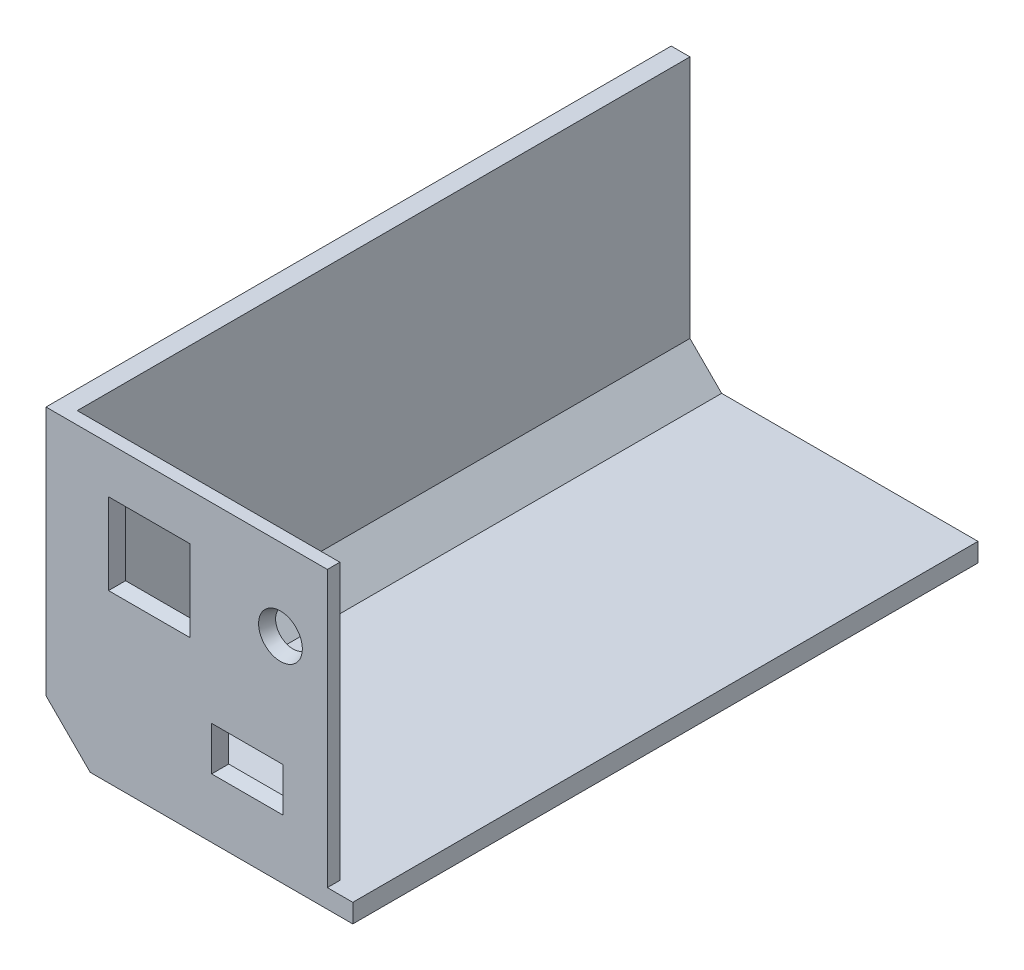
ISO-10303-21;
HEADER;
FILE_DESCRIPTION(('STEP AP214'),'2;1');
FILE_NAME('part.step','',(''),(''),'','','');
FILE_SCHEMA(('AUTOMOTIVE_DESIGN { 1 0 10303 214 1 1 1 1 }'));
ENDSEC;
DATA;
#1=APPLICATION_CONTEXT('core data for automotive mechanical design processes');
#2=APPLICATION_PROTOCOL_DEFINITION('international standard','automotive_design',2000,#1);
#3=PRODUCT_CONTEXT('',#1,'mechanical');
#4=PRODUCT('Part','Part','',(#3));
#5=PRODUCT_RELATED_PRODUCT_CATEGORY('part','',(#4));
#6=PRODUCT_DEFINITION_FORMATION('','',#4);
#7=PRODUCT_DEFINITION_CONTEXT('part definition',#1,'design');
#8=PRODUCT_DEFINITION('design','',#6,#7);
#9=PRODUCT_DEFINITION_SHAPE('','',#8);
#10=(LENGTH_UNIT() NAMED_UNIT(*) SI_UNIT(.MILLI.,.METRE.));
#11=(NAMED_UNIT(*) PLANE_ANGLE_UNIT() SI_UNIT($,.RADIAN.));
#12=(NAMED_UNIT(*) SI_UNIT($,.STERADIAN.) SOLID_ANGLE_UNIT());
#13=UNCERTAINTY_MEASURE_WITH_UNIT(LENGTH_MEASURE(1.E-05),#10,'distance_accuracy_value','');
#14=(GEOMETRIC_REPRESENTATION_CONTEXT(3) GLOBAL_UNCERTAINTY_ASSIGNED_CONTEXT((#13)) GLOBAL_UNIT_ASSIGNED_CONTEXT((#10,
#11,#12)) REPRESENTATION_CONTEXT('',''));
#15=CARTESIAN_POINT('',(0.,0.,0.));
#16=DIRECTION('',(0.,0.,1.));
#17=DIRECTION('',(1.,0.,0.));
#18=AXIS2_PLACEMENT_3D('',#15,#16,#17);
#19=CARTESIAN_POINT('',(0.,0.,100.));
#20=DIRECTION('',(0.,1.,0.));
#21=DIRECTION('',(0.,0.,1.));
#22=AXIS2_PLACEMENT_3D('',#19,#20,#21);
#23=PLANE('',#22);
#24=DIRECTION('',(1.,0.,0.));
#25=VECTOR('',#24,1.);
#26=CARTESIAN_POINT('',(0.,0.,0.));
#27=LINE('',#26,#25);
#28=CARTESIAN_POINT('',(0.,0.,0.));
#29=VERTEX_POINT('',#28);
#30=CARTESIAN_POINT('',(42.,0.,0.));
#31=VERTEX_POINT('',#30);
#32=EDGE_CURVE('E260',#29,#31,#27,.T.);
#33=ORIENTED_EDGE('',*,*,#32,.T.);
#34=DIRECTION('',(0.,0.,-1.));
#35=VECTOR('',#34,1.);
#36=CARTESIAN_POINT('',(42.,0.,100.));
#37=LINE('',#36,#35);
#38=CARTESIAN_POINT('',(42.,0.,100.));
#39=VERTEX_POINT('',#38);
#40=EDGE_CURVE('E11',#39,#31,#37,.T.);
#41=ORIENTED_EDGE('',*,*,#40,.F.);
#42=DIRECTION('',(1.,0.,0.));
#43=VECTOR('',#42,1.);
#44=CARTESIAN_POINT('',(0.,0.,100.));
#45=LINE('',#44,#43);
#46=CARTESIAN_POINT('',(0.,0.,100.));
#47=VERTEX_POINT('',#46);
#48=EDGE_CURVE('E263',#47,#39,#45,.T.);
#49=ORIENTED_EDGE('',*,*,#48,.F.);
#50=DIRECTION('',(0.,0.,-1.));
#51=VECTOR('',#50,1.);
#52=CARTESIAN_POINT('',(0.,0.,100.));
#53=LINE('',#52,#51);
#54=EDGE_CURVE('E278',#47,#29,#53,.T.);
#55=ORIENTED_EDGE('',*,*,#54,.T.);
#56=EDGE_LOOP('',(#33,#41,#49,#55));
#57=FACE_BOUND('',#56,.T.);
#58=ADVANCED_FACE('F43',(#57),#23,.F.);
#59=CARTESIAN_POINT('',(42.,3.,100.));
#60=DIRECTION('',(-1.,0.,0.));
#61=DIRECTION('',(0.,0.,1.));
#62=AXIS2_PLACEMENT_3D('',#59,#60,#61);
#63=PLANE('',#62);
#64=DIRECTION('',(0.,1.,0.));
#65=VECTOR('',#64,1.);
#66=CARTESIAN_POINT('',(42.,3.,0.));
#67=LINE('',#66,#65);
#68=CARTESIAN_POINT('',(42.,3.,0.));
#69=VERTEX_POINT('',#68);
#70=EDGE_CURVE('E281',#31,#69,#67,.T.);
#71=ORIENTED_EDGE('',*,*,#70,.T.);
#72=DIRECTION('',(0.,0.,-1.));
#73=VECTOR('',#72,1.);
#74=CARTESIAN_POINT('',(42.,3.,100.));
#75=LINE('',#74,#73);
#76=CARTESIAN_POINT('',(42.,3.,100.));
#77=VERTEX_POINT('',#76);
#78=EDGE_CURVE('E50',#77,#69,#75,.T.);
#79=ORIENTED_EDGE('',*,*,#78,.F.);
#80=DIRECTION('',(0.,1.,0.));
#81=VECTOR('',#80,1.);
#82=CARTESIAN_POINT('',(42.,3.,100.));
#83=LINE('',#82,#81);
#84=EDGE_CURVE('E266',#39,#77,#83,.T.);
#85=ORIENTED_EDGE('',*,*,#84,.F.);
#86=ORIENTED_EDGE('',*,*,#40,.T.);
#87=EDGE_LOOP('',(#71,#79,#85,#86));
#88=FACE_BOUND('',#87,.T.);
#89=ADVANCED_FACE('F337',(#88),#63,.F.);
#90=CARTESIAN_POINT('',(1.,3.,100.));
#91=DIRECTION('',(0.,-1.,0.));
#92=DIRECTION('',(0.,0.,-1.));
#93=AXIS2_PLACEMENT_3D('',#90,#91,#92);
#94=PLANE('',#93);
#95=DIRECTION('',(1.,0.,0.));
#96=VECTOR('',#95,1.);
#97=CARTESIAN_POINT('',(1.,3.,98.));
#98=LINE('',#97,#96);
#99=CARTESIAN_POINT('',(1.,3.,98.));
#100=VERTEX_POINT('',#99);
#101=CARTESIAN_POINT('',(37.9289321881345,3.,98.));
#102=VERTEX_POINT('',#101);
#103=EDGE_CURVE('E239',#100,#102,#98,.T.);
#104=ORIENTED_EDGE('',*,*,#103,.T.);
#105=DIRECTION('',(0.,0.,1.));
#106=VECTOR('',#105,1.);
#107=CARTESIAN_POINT('',(37.9289321881345,3.,98.));
#108=LINE('',#107,#106);
#109=CARTESIAN_POINT('',(37.9289321881345,3.,100.));
#110=VERTEX_POINT('',#109);
#111=EDGE_CURVE('E254',#102,#110,#108,.T.);
#112=ORIENTED_EDGE('',*,*,#111,.T.);
#113=DIRECTION('',(-1.,0.,0.));
#114=VECTOR('',#113,1.);
#115=CARTESIAN_POINT('',(1.,3.,100.));
#116=LINE('',#115,#114);
#117=EDGE_CURVE('E269',#77,#110,#116,.T.);
#118=ORIENTED_EDGE('',*,*,#117,.F.);
#119=ORIENTED_EDGE('',*,*,#78,.T.);
#120=DIRECTION('',(-1.,0.,0.));
#121=VECTOR('',#120,1.);
#122=CARTESIAN_POINT('',(1.,3.,0.));
#123=LINE('',#122,#121);
#124=CARTESIAN_POINT('',(1.,3.,0.));
#125=VERTEX_POINT('',#124);
#126=EDGE_CURVE('E283',#69,#125,#123,.T.);
#127=ORIENTED_EDGE('',*,*,#126,.T.);
#128=DIRECTION('',(0.,0.,-1.));
#129=VECTOR('',#128,1.);
#130=CARTESIAN_POINT('',(1.,3.,100.));
#131=LINE('',#130,#129);
#132=EDGE_CURVE('E309',#100,#125,#131,.T.);
#133=ORIENTED_EDGE('',*,*,#132,.F.);
#134=EDGE_LOOP('',(#104,#112,#118,#119,#127,#133));
#135=FACE_BOUND('',#134,.T.);
#136=ADVANCED_FACE('F315',(#135),#94,.F.);
#137=CARTESIAN_POINT('',(-4.07106781186546,8.07106781186548,100.));
#138=DIRECTION('',(-0.707106781186549,-0.707106781186546,0.));
#139=DIRECTION('',(0.707106781186546,-0.707106781186549,0.));
#140=AXIS2_PLACEMENT_3D('',#137,#138,#139);
#141=PLANE('',#140);
#142=DIRECTION('',(0.,0.,-1.));
#143=VECTOR('',#142,1.);
#144=CARTESIAN_POINT('',(-4.07106781186546,8.07106781186548,100.));
#145=LINE('',#144,#143);
#146=CARTESIAN_POINT('',(-4.07106781186546,8.07106781186548,98.));
#147=VERTEX_POINT('',#146);
#148=CARTESIAN_POINT('',(-4.07106781186546,8.07106781186548,0.));
#149=VERTEX_POINT('',#148);
#150=EDGE_CURVE('E307',#147,#149,#145,.T.);
#151=ORIENTED_EDGE('',*,*,#150,.F.);
#152=DIRECTION('',(0.707106781186546,-0.707106781186549,0.));
#153=VECTOR('',#152,1.);
#154=CARTESIAN_POINT('',(-4.07106781186546,8.07106781186548,98.));
#155=LINE('',#154,#153);
#156=EDGE_CURVE('E251',#147,#100,#155,.T.);
#157=ORIENTED_EDGE('',*,*,#156,.T.);
#158=ORIENTED_EDGE('',*,*,#132,.T.);
#159=DIRECTION('',(-0.707106781186546,0.707106781186549,0.));
#160=VECTOR('',#159,1.);
#161=CARTESIAN_POINT('',(-4.07106781186546,8.07106781186548,0.));
#162=LINE('',#161,#160);
#163=EDGE_CURVE('E286',#125,#149,#162,.T.);
#164=ORIENTED_EDGE('',*,*,#163,.T.);
#165=EDGE_LOOP('',(#151,#157,#158,#164));
#166=FACE_BOUND('',#165,.T.);
#167=ADVANCED_FACE('F326',(#166),#141,.F.);
#168=CARTESIAN_POINT('',(-4.07106781186547,47.0737593986685,100.));
#169=DIRECTION('',(-1.,0.,0.));
#170=DIRECTION('',(0.,-1.,0.));
#171=AXIS2_PLACEMENT_3D('',#168,#169,#170);
#172=PLANE('',#171);
#173=DIRECTION('',(0.,0.,-1.));
#174=VECTOR('',#173,1.);
#175=CARTESIAN_POINT('',(-4.07106781186547,47.0737593986685,100.));
#176=LINE('',#175,#174);
#177=CARTESIAN_POINT('',(-4.07106781186547,47.0737593986685,98.));
#178=VERTEX_POINT('',#177);
#179=CARTESIAN_POINT('',(-4.07106781186547,47.0737593986685,0.));
#180=VERTEX_POINT('',#179);
#181=EDGE_CURVE('E305',#178,#180,#176,.T.);
#182=ORIENTED_EDGE('',*,*,#181,.F.);
#183=DIRECTION('',(0.,-1.,0.));
#184=VECTOR('',#183,1.);
#185=CARTESIAN_POINT('',(-4.07106781186547,47.0737593986685,98.));
#186=LINE('',#185,#184);
#187=EDGE_CURVE('E248',#178,#147,#186,.T.);
#188=ORIENTED_EDGE('',*,*,#187,.T.);
#189=ORIENTED_EDGE('',*,*,#150,.T.);
#190=DIRECTION('',(0.,1.,0.));
#191=VECTOR('',#190,1.);
#192=CARTESIAN_POINT('',(-4.07106781186547,47.0737593986685,0.));
#193=LINE('',#192,#191);
#194=EDGE_CURVE('E289',#149,#180,#193,.T.);
#195=ORIENTED_EDGE('',*,*,#194,.T.);
#196=EDGE_LOOP('',(#182,#188,#189,#195));
#197=FACE_BOUND('',#196,.T.);
#198=ADVANCED_FACE('F353',(#197),#172,.F.);
#199=CARTESIAN_POINT('',(-7.07106781186547,47.0737593986685,100.));
#200=DIRECTION('',(0.,-1.,0.));
#201=DIRECTION('',(0.,0.,-1.));
#202=AXIS2_PLACEMENT_3D('',#199,#200,#201);
#203=PLANE('',#202);
#204=DIRECTION('',(-1.,0.,0.));
#205=VECTOR('',#204,1.);
#206=CARTESIAN_POINT('',(-7.07106781186547,47.0737593986685,0.));
#207=LINE('',#206,#205);
#208=CARTESIAN_POINT('',(-7.07106781186547,47.0737593986685,0.));
#209=VERTEX_POINT('',#208);
#210=EDGE_CURVE('E292',#180,#209,#207,.T.);
#211=ORIENTED_EDGE('',*,*,#210,.T.);
#212=DIRECTION('',(0.,0.,-1.));
#213=VECTOR('',#212,1.);
#214=CARTESIAN_POINT('',(-7.07106781186547,47.0737593986685,100.));
#215=LINE('',#214,#213);
#216=CARTESIAN_POINT('',(-7.07106781186547,47.0737593986685,100.));
#217=VERTEX_POINT('',#216);
#218=EDGE_CURVE('E302',#217,#209,#215,.T.);
#219=ORIENTED_EDGE('',*,*,#218,.F.);
#220=DIRECTION('',(-1.,0.,0.));
#221=VECTOR('',#220,1.);
#222=CARTESIAN_POINT('',(-7.07106781186547,47.0737593986685,100.));
#223=LINE('',#222,#221);
#224=CARTESIAN_POINT('',(37.9289321881345,47.0737593986685,100.));
#225=VERTEX_POINT('',#224);
#226=EDGE_CURVE('E272',#225,#217,#223,.T.);
#227=ORIENTED_EDGE('',*,*,#226,.F.);
#228=DIRECTION('',(0.,0.,1.));
#229=VECTOR('',#228,1.);
#230=CARTESIAN_POINT('',(37.9289321881345,47.0737593986685,98.));
#231=LINE('',#230,#229);
#232=CARTESIAN_POINT('',(37.9289321881345,47.0737593986685,98.));
#233=VERTEX_POINT('',#232);
#234=EDGE_CURVE('E257',#233,#225,#231,.T.);
#235=ORIENTED_EDGE('',*,*,#234,.F.);
#236=DIRECTION('',(-1.,0.,0.));
#237=VECTOR('',#236,1.);
#238=CARTESIAN_POINT('',(-4.07106781186547,47.0737593986685,98.));
#239=LINE('',#238,#237);
#240=EDGE_CURVE('E245',#233,#178,#239,.T.);
#241=ORIENTED_EDGE('',*,*,#240,.T.);
#242=ORIENTED_EDGE('',*,*,#181,.T.);
#243=EDGE_LOOP('',(#211,#219,#227,#235,#241,#242));
#244=FACE_BOUND('',#243,.T.);
#245=ADVANCED_FACE('F350',(#244),#203,.F.);
#246=CARTESIAN_POINT('',(-7.07106781186547,47.0737593986685,100.));
#247=DIRECTION('',(1.,0.,0.));
#248=DIRECTION('',(0.,1.,0.));
#249=AXIS2_PLACEMENT_3D('',#246,#247,#248);
#250=PLANE('',#249);
#251=DIRECTION('',(0.,-1.,0.));
#252=VECTOR('',#251,1.);
#253=CARTESIAN_POINT('',(-7.07106781186547,47.0737593986685,0.));
#254=LINE('',#253,#252);
#255=CARTESIAN_POINT('',(-7.07106781186546,7.07106781186549,0.));
#256=VERTEX_POINT('',#255);
#257=EDGE_CURVE('E294',#209,#256,#254,.T.);
#258=ORIENTED_EDGE('',*,*,#257,.T.);
#259=DIRECTION('',(0.,0.,-1.));
#260=VECTOR('',#259,1.);
#261=CARTESIAN_POINT('',(-7.07106781186546,7.07106781186549,100.));
#262=LINE('',#261,#260);
#263=CARTESIAN_POINT('',(-7.07106781186546,7.07106781186549,100.));
#264=VERTEX_POINT('',#263);
#265=EDGE_CURVE('E299',#264,#256,#262,.T.);
#266=ORIENTED_EDGE('',*,*,#265,.F.);
#267=DIRECTION('',(0.,-1.,0.));
#268=VECTOR('',#267,1.);
#269=CARTESIAN_POINT('',(-7.07106781186547,47.0737593986685,100.));
#270=LINE('',#269,#268);
#271=EDGE_CURVE('E274',#217,#264,#270,.T.);
#272=ORIENTED_EDGE('',*,*,#271,.F.);
#273=ORIENTED_EDGE('',*,*,#218,.T.);
#274=EDGE_LOOP('',(#258,#266,#272,#273));
#275=FACE_BOUND('',#274,.T.);
#276=ADVANCED_FACE('F348',(#275),#250,.F.);
#277=CARTESIAN_POINT('',(-7.07106781186546,7.07106781186549,100.));
#278=DIRECTION('',(0.707106781186549,0.707106781186546,0.));
#279=DIRECTION('',(-0.707106781186546,0.707106781186549,0.));
#280=AXIS2_PLACEMENT_3D('',#277,#278,#279);
#281=PLANE('',#280);
#282=DIRECTION('',(0.707106781186546,-0.707106781186549,0.));
#283=VECTOR('',#282,1.);
#284=CARTESIAN_POINT('',(-7.07106781186546,7.07106781186549,0.));
#285=LINE('',#284,#283);
#286=EDGE_CURVE('E267',#256,#29,#285,.T.);
#287=ORIENTED_EDGE('',*,*,#286,.T.);
#288=ORIENTED_EDGE('',*,*,#54,.F.);
#289=DIRECTION('',(0.707106781186546,-0.707106781186549,0.));
#290=VECTOR('',#289,1.);
#291=CARTESIAN_POINT('',(-7.07106781186546,7.07106781186549,100.));
#292=LINE('',#291,#290);
#293=EDGE_CURVE('E276',#264,#47,#292,.T.);
#294=ORIENTED_EDGE('',*,*,#293,.F.);
#295=ORIENTED_EDGE('',*,*,#265,.T.);
#296=EDGE_LOOP('',(#287,#288,#294,#295));
#297=FACE_BOUND('',#296,.T.);
#298=ADVANCED_FACE('F343',(#297),#281,.F.);
#299=CARTESIAN_POINT('',(0.,0.,100.));
#300=DIRECTION('',(0.,0.,-1.));
#301=DIRECTION('',(-1.,0.,0.));
#302=AXIS2_PLACEMENT_3D('',#299,#300,#301);
#303=PLANE('',#302);
#304=DIRECTION('',(-1.,0.,0.));
#305=VECTOR('',#304,1.);
#306=CARTESIAN_POINT('',(2.92893218813453,39.6440022228814,100.));
#307=LINE('',#306,#305);
#308=CARTESIAN_POINT('',(15.9289321881345,39.6440022228814,100.));
#309=VERTEX_POINT('',#308);
#310=CARTESIAN_POINT('',(2.92893218813453,39.6440022228814,100.));
#311=VERTEX_POINT('',#310);
#312=EDGE_CURVE('E220',#309,#311,#307,.T.);
#313=ORIENTED_EDGE('',*,*,#312,.F.);
#314=DIRECTION('',(0.,1.,0.));
#315=VECTOR('',#314,1.);
#316=CARTESIAN_POINT('',(15.9289321881345,39.6440022228814,100.));
#317=LINE('',#316,#315);
#318=CARTESIAN_POINT('',(15.9289321881345,26.6440022228814,100.));
#319=VERTEX_POINT('',#318);
#320=EDGE_CURVE('E57',#319,#309,#317,.T.);
#321=ORIENTED_EDGE('',*,*,#320,.F.);
#322=DIRECTION('',(1.,0.,0.));
#323=VECTOR('',#322,1.);
#324=CARTESIAN_POINT('',(2.92893218813453,26.6440022228814,100.));
#325=LINE('',#324,#323);
#326=CARTESIAN_POINT('',(2.92893218813453,26.6440022228814,100.));
#327=VERTEX_POINT('',#326);
#328=EDGE_CURVE('E213',#327,#319,#325,.T.);
#329=ORIENTED_EDGE('',*,*,#328,.F.);
#330=DIRECTION('',(0.,-1.,0.));
#331=VECTOR('',#330,1.);
#332=CARTESIAN_POINT('',(2.92893218813453,39.6440022228814,100.));
#333=LINE('',#332,#331);
#334=EDGE_CURVE('E217',#311,#327,#333,.T.);
#335=ORIENTED_EDGE('',*,*,#334,.F.);
#336=EDGE_LOOP('',(#313,#321,#329,#335));
#337=FACE_BOUND('',#336,.T.);
#338=DIRECTION('',(-1.,0.,0.));
#339=VECTOR('',#338,1.);
#340=CARTESIAN_POINT('',(19.4289321881345,16.5,100.));
#341=LINE('',#340,#339);
#342=CARTESIAN_POINT('',(30.8759582309003,16.5,100.));
#343=VERTEX_POINT('',#342);
#344=CARTESIAN_POINT('',(19.4289321881345,16.5,100.));
#345=VERTEX_POINT('',#344);
#346=EDGE_CURVE('E191',#343,#345,#341,.T.);
#347=ORIENTED_EDGE('',*,*,#346,.F.);
#348=DIRECTION('',(0.,1.,0.));
#349=VECTOR('',#348,1.);
#350=CARTESIAN_POINT('',(30.8759582309003,16.5,100.));
#351=LINE('',#350,#349);
#352=CARTESIAN_POINT('',(30.8759582309003,9.5,100.));
#353=VERTEX_POINT('',#352);
#354=EDGE_CURVE('E65',#353,#343,#351,.T.);
#355=ORIENTED_EDGE('',*,*,#354,.F.);
#356=DIRECTION('',(1.,0.,0.));
#357=VECTOR('',#356,1.);
#358=CARTESIAN_POINT('',(19.4289321881345,9.5,100.));
#359=LINE('',#358,#357);
#360=CARTESIAN_POINT('',(19.4289321881345,9.5,100.));
#361=VERTEX_POINT('',#360);
#362=EDGE_CURVE('E178',#361,#353,#359,.T.);
#363=ORIENTED_EDGE('',*,*,#362,.F.);
#364=DIRECTION('',(0.,-1.,0.));
#365=VECTOR('',#364,1.);
#366=CARTESIAN_POINT('',(19.4289321881345,16.5,100.));
#367=LINE('',#366,#365);
#368=EDGE_CURVE('E184',#345,#361,#367,.T.);
#369=ORIENTED_EDGE('',*,*,#368,.F.);
#370=EDGE_LOOP('',(#347,#355,#363,#369));
#371=FACE_BOUND('',#370,.T.);
#372=CARTESIAN_POINT('',(30.4289321881345,34.0737593986685,100.));
#373=DIRECTION('',(0.,0.,1.));
#374=DIRECTION('',(1.,0.,0.));
#375=AXIS2_PLACEMENT_3D('',#372,#373,#374);
#376=CIRCLE('',#375,3.5);
#377=CARTESIAN_POINT('',(33.9289321881345,34.0737593986685,100.));
#378=VERTEX_POINT('',#377);
#379=EDGE_CURVE('E233',#378,#378,#376,.T.);
#380=ORIENTED_EDGE('',*,*,#379,.F.);
#381=EDGE_LOOP('',(#380));
#382=FACE_BOUND('',#381,.T.);
#383=ORIENTED_EDGE('',*,*,#117,.T.);
#384=DIRECTION('',(0.,1.,0.));
#385=VECTOR('',#384,1.);
#386=CARTESIAN_POINT('',(37.9289321881345,47.0737593986685,100.));
#387=LINE('',#386,#385);
#388=EDGE_CURVE('E236',#110,#225,#387,.T.);
#389=ORIENTED_EDGE('',*,*,#388,.T.);
#390=ORIENTED_EDGE('',*,*,#226,.T.);
#391=ORIENTED_EDGE('',*,*,#271,.T.);
#392=ORIENTED_EDGE('',*,*,#293,.T.);
#393=ORIENTED_EDGE('',*,*,#48,.T.);
#394=ORIENTED_EDGE('',*,*,#84,.T.);
#395=EDGE_LOOP('',(#383,#389,#390,#391,#392,#393,#394));
#396=FACE_BOUND('',#395,.T.);
#397=ADVANCED_FACE('F188',(#337,#371,#382,#396),#303,.F.);
#398=CARTESIAN_POINT('',(0.,0.,0.));
#399=DIRECTION('',(0.,0.,-1.));
#400=DIRECTION('',(-1.,0.,0.));
#401=AXIS2_PLACEMENT_3D('',#398,#399,#400);
#402=PLANE('',#401);
#403=ORIENTED_EDGE('',*,*,#32,.F.);
#404=ORIENTED_EDGE('',*,*,#286,.F.);
#405=ORIENTED_EDGE('',*,*,#257,.F.);
#406=ORIENTED_EDGE('',*,*,#210,.F.);
#407=ORIENTED_EDGE('',*,*,#194,.F.);
#408=ORIENTED_EDGE('',*,*,#163,.F.);
#409=ORIENTED_EDGE('',*,*,#126,.F.);
#410=ORIENTED_EDGE('',*,*,#70,.F.);
#411=EDGE_LOOP('',(#403,#404,#405,#406,#407,#408,#409,#410));
#412=FACE_BOUND('',#411,.T.);
#413=ADVANCED_FACE('F321',(#412),#402,.T.);
#414=CARTESIAN_POINT('',(37.9289321881345,47.0737593986685,98.));
#415=DIRECTION('',(1.,0.,0.));
#416=DIRECTION('',(0.,1.,0.));
#417=AXIS2_PLACEMENT_3D('',#414,#415,#416);
#418=PLANE('',#417);
#419=ORIENTED_EDGE('',*,*,#388,.F.);
#420=ORIENTED_EDGE('',*,*,#111,.F.);
#421=DIRECTION('',(0.,1.,0.));
#422=VECTOR('',#421,1.);
#423=CARTESIAN_POINT('',(37.9289321881345,47.0737593986685,98.));
#424=LINE('',#423,#422);
#425=EDGE_CURVE('E242',#102,#233,#424,.T.);
#426=ORIENTED_EDGE('',*,*,#425,.T.);
#427=ORIENTED_EDGE('',*,*,#234,.T.);
#428=EDGE_LOOP('',(#419,#420,#426,#427));
#429=FACE_BOUND('',#428,.T.);
#430=ADVANCED_FACE('F332',(#429),#418,.T.);
#431=CARTESIAN_POINT('',(0.,0.,98.));
#432=DIRECTION('',(0.,0.,-1.));
#433=DIRECTION('',(-1.,0.,0.));
#434=AXIS2_PLACEMENT_3D('',#431,#432,#433);
#435=PLANE('',#434);
#436=DIRECTION('',(0.,1.,0.));
#437=VECTOR('',#436,1.);
#438=CARTESIAN_POINT('',(15.2009917196021,39.6440022228814,98.));
#439=LINE('',#438,#437);
#440=CARTESIAN_POINT('',(15.2009917196021,27.3719426914138,98.));
#441=VERTEX_POINT('',#440);
#442=CARTESIAN_POINT('',(15.2009917196021,38.916061754349,98.));
#443=VERTEX_POINT('',#442);
#444=EDGE_CURVE('E224',#441,#443,#439,.T.);
#445=ORIENTED_EDGE('',*,*,#444,.T.);
#446=DIRECTION('',(-1.,0.,0.));
#447=VECTOR('',#446,1.);
#448=CARTESIAN_POINT('',(2.92893218813453,38.916061754349,98.));
#449=LINE('',#448,#447);
#450=CARTESIAN_POINT('',(3.65687265666693,38.916061754349,98.));
#451=VERTEX_POINT('',#450);
#452=EDGE_CURVE('E203',#443,#451,#449,.T.);
#453=ORIENTED_EDGE('',*,*,#452,.T.);
#454=DIRECTION('',(0.,-1.,0.));
#455=VECTOR('',#454,1.);
#456=CARTESIAN_POINT('',(3.65687265666693,39.6440022228814,98.));
#457=LINE('',#456,#455);
#458=CARTESIAN_POINT('',(3.65687265666694,27.3719426914138,98.));
#459=VERTEX_POINT('',#458);
#460=EDGE_CURVE('E230',#451,#459,#457,.T.);
#461=ORIENTED_EDGE('',*,*,#460,.T.);
#462=DIRECTION('',(1.,0.,0.));
#463=VECTOR('',#462,1.);
#464=CARTESIAN_POINT('',(2.92893218813453,27.3719426914138,98.));
#465=LINE('',#464,#463);
#466=EDGE_CURVE('E227',#459,#441,#465,.T.);
#467=ORIENTED_EDGE('',*,*,#466,.T.);
#468=EDGE_LOOP('',(#445,#453,#461,#467));
#469=FACE_BOUND('',#468,.T.);
#470=DIRECTION('',(0.,1.,0.));
#471=VECTOR('',#470,1.);
#472=CARTESIAN_POINT('',(30.1480177623679,16.5,98.));
#473=LINE('',#472,#471);
#474=CARTESIAN_POINT('',(30.1480177623679,10.2279404685324,98.));
#475=VERTEX_POINT('',#474);
#476=CARTESIAN_POINT('',(30.1480177623679,15.7720595314676,98.));
#477=VERTEX_POINT('',#476);
#478=EDGE_CURVE('E171',#475,#477,#473,.T.);
#479=ORIENTED_EDGE('',*,*,#478,.T.);
#480=DIRECTION('',(-1.,0.,0.));
#481=VECTOR('',#480,1.);
#482=CARTESIAN_POINT('',(19.4289321881345,15.7720595314676,98.));
#483=LINE('',#482,#481);
#484=CARTESIAN_POINT('',(20.1568726566669,15.7720595314676,98.));
#485=VERTEX_POINT('',#484);
#486=EDGE_CURVE('E175',#477,#485,#483,.T.);
#487=ORIENTED_EDGE('',*,*,#486,.T.);
#488=DIRECTION('',(0.,-1.,0.));
#489=VECTOR('',#488,1.);
#490=CARTESIAN_POINT('',(20.1568726566669,16.5,98.));
#491=LINE('',#490,#489);
#492=CARTESIAN_POINT('',(20.1568726566669,10.2279404685324,98.));
#493=VERTEX_POINT('',#492);
#494=EDGE_CURVE('E199',#485,#493,#491,.T.);
#495=ORIENTED_EDGE('',*,*,#494,.T.);
#496=DIRECTION('',(1.,0.,0.));
#497=VECTOR('',#496,1.);
#498=CARTESIAN_POINT('',(19.4289321881345,10.2279404685324,98.));
#499=LINE('',#498,#497);
#500=EDGE_CURVE('E193',#493,#475,#499,.T.);
#501=ORIENTED_EDGE('',*,*,#500,.T.);
#502=EDGE_LOOP('',(#479,#487,#495,#501));
#503=FACE_BOUND('',#502,.T.);
#504=CARTESIAN_POINT('',(30.4289321881345,34.0737593986685,98.));
#505=DIRECTION('',(0.,0.,-1.));
#506=DIRECTION('',(-1.,0.,0.));
#507=AXIS2_PLACEMENT_3D('',#504,#505,#506);
#508=CIRCLE('',#507,2.77205953146759);
#509=CARTESIAN_POINT('',(27.6568726566669,34.0737593986685,98.));
#510=VERTEX_POINT('',#509);
#511=EDGE_CURVE('E202',#510,#510,#508,.F.);
#512=ORIENTED_EDGE('',*,*,#511,.T.);
#513=EDGE_LOOP('',(#512));
#514=FACE_BOUND('',#513,.T.);
#515=ORIENTED_EDGE('',*,*,#103,.F.);
#516=ORIENTED_EDGE('',*,*,#156,.F.);
#517=ORIENTED_EDGE('',*,*,#187,.F.);
#518=ORIENTED_EDGE('',*,*,#240,.F.);
#519=ORIENTED_EDGE('',*,*,#425,.F.);
#520=EDGE_LOOP('',(#515,#516,#517,#518,#519));
#521=FACE_BOUND('',#520,.T.);
#522=ADVANCED_FACE('F329',(#469,#503,#514,#521),#435,.T.);
#523=CARTESIAN_POINT('',(30.4289321881345,34.0737593986685,100.));
#524=DIRECTION('',(0.,0.,1.));
#525=DIRECTION('',(1.,0.,0.));
#526=AXIS2_PLACEMENT_3D('',#523,#524,#525);
#527=CONICAL_SURFACE('',#526,3.5,0.349065850398866);
#528=ORIENTED_EDGE('',*,*,#511,.F.);
#529=EDGE_LOOP('',(#528));
#530=FACE_BOUND('',#529,.T.);
#531=ORIENTED_EDGE('',*,*,#379,.T.);
#532=EDGE_LOOP('',(#531));
#533=FACE_BOUND('',#532,.T.);
#534=ADVANCED_FACE('F437',(#530,#533),#527,.F.);
#535=CARTESIAN_POINT('',(30.8759582309003,16.5,100.));
#536=DIRECTION('',(0.939692620785908,0.,-0.342020143325669));
#537=DIRECTION('',(-0.342020143325669,0.,-0.939692620785908));
#538=AXIS2_PLACEMENT_3D('',#535,#536,#537);
#539=PLANE('',#538);
#540=DIRECTION('',(0.323615577118185,-0.323615577118185,0.889126490715988));
#541=VECTOR('',#540,1.);
#542=CARTESIAN_POINT('',(29.6771450565657,10.6988131743345,96.7062878733711));
#543=LINE('',#542,#541);
#544=EDGE_CURVE('E167',#475,#353,#543,.T.);
#545=ORIENTED_EDGE('',*,*,#544,.T.);
#546=ORIENTED_EDGE('',*,*,#354,.T.);
#547=DIRECTION('',(0.323615577118185,0.323615577118185,0.889126490715988));
#548=VECTOR('',#547,1.);
#549=CARTESIAN_POINT('',(30.8759582309003,16.5,100.));
#550=LINE('',#549,#548);
#551=EDGE_CURVE('E185',#477,#343,#550,.T.);
#552=ORIENTED_EDGE('',*,*,#551,.F.);
#553=ORIENTED_EDGE('',*,*,#478,.F.);
#554=EDGE_LOOP('',(#545,#546,#552,#553));
#555=FACE_BOUND('',#554,.T.);
#556=ADVANCED_FACE('F169',(#555),#539,.F.);
#557=CARTESIAN_POINT('',(19.4289321881345,9.5,100.));
#558=DIRECTION('',(0.,-0.939692620785908,-0.342020143325669));
#559=DIRECTION('',(0.,0.342020143325669,-0.939692620785909));
#560=AXIS2_PLACEMENT_3D('',#557,#558,#559);
#561=PLANE('',#560);
#562=DIRECTION('',(-0.323615577118185,-0.323615577118185,0.889126490715988));
#563=VECTOR('',#562,1.);
#564=CARTESIAN_POINT('',(20.1620214804093,10.2330892922747,97.9858537230312));
#565=LINE('',#564,#563);
#566=EDGE_CURVE('E174',#493,#361,#565,.T.);
#567=ORIENTED_EDGE('',*,*,#566,.T.);
#568=ORIENTED_EDGE('',*,*,#362,.T.);
#569=ORIENTED_EDGE('',*,*,#544,.F.);
#570=ORIENTED_EDGE('',*,*,#500,.F.);
#571=EDGE_LOOP('',(#567,#568,#569,#570));
#572=FACE_BOUND('',#571,.T.);
#573=ADVANCED_FACE('F179',(#572),#561,.F.);
#574=CARTESIAN_POINT('',(19.4289321881345,16.5,100.));
#575=DIRECTION('',(-0.939692620785908,0.,-0.342020143325669));
#576=DIRECTION('',(-0.342020143325669,0.,0.939692620785908));
#577=AXIS2_PLACEMENT_3D('',#574,#575,#576);
#578=PLANE('',#577);
#579=DIRECTION('',(-0.323615577118185,0.323615577118185,0.889126490715988));
#580=VECTOR('',#579,1.);
#581=CARTESIAN_POINT('',(19.4289321881345,16.5,100.));
#582=LINE('',#581,#580);
#583=EDGE_CURVE('E638',#485,#345,#582,.T.);
#584=ORIENTED_EDGE('',*,*,#583,.T.);
#585=ORIENTED_EDGE('',*,*,#368,.T.);
#586=ORIENTED_EDGE('',*,*,#566,.F.);
#587=ORIENTED_EDGE('',*,*,#494,.F.);
#588=EDGE_LOOP('',(#584,#585,#586,#587));
#589=FACE_BOUND('',#588,.T.);
#590=ADVANCED_FACE('F464',(#589),#578,.F.);
#591=CARTESIAN_POINT('',(19.4289321881345,16.5,100.));
#592=DIRECTION('',(0.,0.939692620785908,-0.342020143325669));
#593=DIRECTION('',(0.,0.342020143325669,0.939692620785909));
#594=AXIS2_PLACEMENT_3D('',#591,#592,#593);
#595=PLANE('',#594);
#596=ORIENTED_EDGE('',*,*,#551,.T.);
#597=ORIENTED_EDGE('',*,*,#346,.T.);
#598=ORIENTED_EDGE('',*,*,#583,.F.);
#599=ORIENTED_EDGE('',*,*,#486,.F.);
#600=EDGE_LOOP('',(#596,#597,#598,#599));
#601=FACE_BOUND('',#600,.T.);
#602=ADVANCED_FACE('F473',(#601),#595,.F.);
#603=CARTESIAN_POINT('',(15.9289321881345,39.6440022228814,100.));
#604=DIRECTION('',(0.939692620785908,0.,-0.342020143325669));
#605=DIRECTION('',(-0.342020143325669,0.,-0.939692620785908));
#606=AXIS2_PLACEMENT_3D('',#603,#604,#605);
#607=PLANE('',#606);
#608=DIRECTION('',(0.323615577118185,-0.323615577118185,0.889126490715988));
#609=VECTOR('',#608,1.);
#610=CARTESIAN_POINT('',(14.5674806453386,28.0054537656773,96.2594426284864));
#611=LINE('',#610,#609);
#612=EDGE_CURVE('E206',#441,#319,#611,.T.);
#613=ORIENTED_EDGE('',*,*,#612,.T.);
#614=ORIENTED_EDGE('',*,*,#320,.T.);
#615=DIRECTION('',(0.323615577118185,0.323615577118185,0.889126490715988));
#616=VECTOR('',#615,1.);
#617=CARTESIAN_POINT('',(15.9289321881345,39.6440022228814,100.));
#618=LINE('',#617,#616);
#619=EDGE_CURVE('E211',#443,#309,#618,.T.);
#620=ORIENTED_EDGE('',*,*,#619,.F.);
#621=ORIENTED_EDGE('',*,*,#444,.F.);
#622=EDGE_LOOP('',(#613,#614,#620,#621));
#623=FACE_BOUND('',#622,.T.);
#624=ADVANCED_FACE('F483',(#623),#607,.F.);
#625=CARTESIAN_POINT('',(2.92893218813453,26.6440022228814,100.));
#626=DIRECTION('',(0.,-0.939692620785908,-0.342020143325669));
#627=DIRECTION('',(0.,0.342020143325669,-0.939692620785908));
#628=AXIS2_PLACEMENT_3D('',#625,#626,#627);
#629=PLANE('',#628);
#630=DIRECTION('',(-0.323615577118185,-0.323615577118185,0.889126490715988));
#631=VECTOR('',#630,1.);
#632=CARTESIAN_POINT('',(4.2903837309305,28.0054537656773,96.2594426284864));
#633=LINE('',#632,#631);
#634=EDGE_CURVE('E207',#459,#327,#633,.T.);
#635=ORIENTED_EDGE('',*,*,#634,.T.);
#636=ORIENTED_EDGE('',*,*,#328,.T.);
#637=ORIENTED_EDGE('',*,*,#612,.F.);
#638=ORIENTED_EDGE('',*,*,#466,.F.);
#639=EDGE_LOOP('',(#635,#636,#637,#638));
#640=FACE_BOUND('',#639,.T.);
#641=ADVANCED_FACE('F493',(#640),#629,.F.);
#642=CARTESIAN_POINT('',(2.92893218813453,39.6440022228814,100.));
#643=DIRECTION('',(-0.939692620785908,0.,-0.342020143325669));
#644=DIRECTION('',(-0.342020143325669,0.,0.939692620785908));
#645=AXIS2_PLACEMENT_3D('',#642,#643,#644);
#646=PLANE('',#645);
#647=DIRECTION('',(-0.323615577118185,0.323615577118185,0.889126490715988));
#648=VECTOR('',#647,1.);
#649=CARTESIAN_POINT('',(2.92893218813453,39.6440022228814,100.));
#650=LINE('',#649,#648);
#651=EDGE_CURVE('E209',#451,#311,#650,.T.);
#652=ORIENTED_EDGE('',*,*,#651,.T.);
#653=ORIENTED_EDGE('',*,*,#334,.T.);
#654=ORIENTED_EDGE('',*,*,#634,.F.);
#655=ORIENTED_EDGE('',*,*,#460,.F.);
#656=EDGE_LOOP('',(#652,#653,#654,#655));
#657=FACE_BOUND('',#656,.T.);
#658=ADVANCED_FACE('F502',(#657),#646,.F.);
#659=CARTESIAN_POINT('',(2.92893218813453,39.6440022228814,100.));
#660=DIRECTION('',(0.,0.939692620785908,-0.342020143325669));
#661=DIRECTION('',(0.,0.342020143325669,0.939692620785909));
#662=AXIS2_PLACEMENT_3D('',#659,#660,#661);
#663=PLANE('',#662);
#664=ORIENTED_EDGE('',*,*,#619,.T.);
#665=ORIENTED_EDGE('',*,*,#312,.T.);
#666=ORIENTED_EDGE('',*,*,#651,.F.);
#667=ORIENTED_EDGE('',*,*,#452,.F.);
#668=EDGE_LOOP('',(#664,#665,#666,#667));
#669=FACE_BOUND('',#668,.T.);
#670=ADVANCED_FACE('F512',(#669),#663,.F.);
#671=CLOSED_SHELL('',(#58,#89,#136,#167,#198,#245,#276,#298,#397,#413,#430,#522,#534,#556,#573,
#590,#602,#624,#641,#658,#670));
#672=MANIFOLD_SOLID_BREP('B2',#671);
#673=ADVANCED_BREP_SHAPE_REPRESENTATION('',(#18,#672),#14);
#674=SHAPE_DEFINITION_REPRESENTATION(#9,#673);
ENDSEC;
END-ISO-10303-21;
